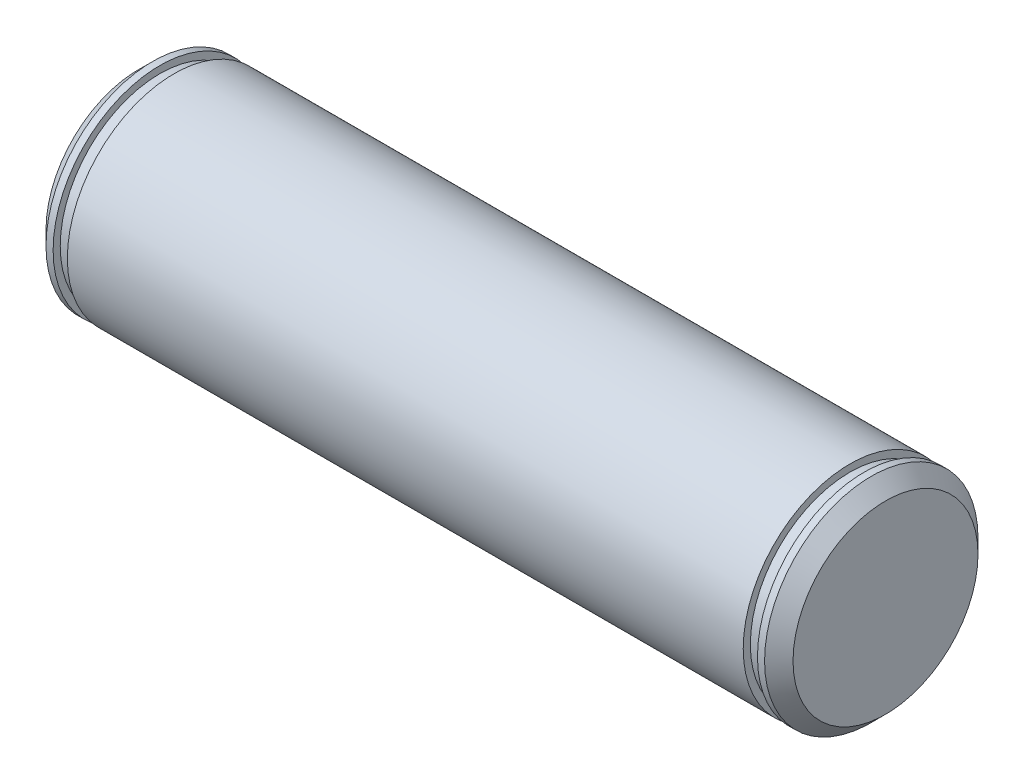
ISO-10303-21;
HEADER;
FILE_DESCRIPTION(('STEP AP214'),'2;1');
FILE_NAME('part.step','',(''),(''),'','','');
FILE_SCHEMA(('AUTOMOTIVE_DESIGN { 1 0 10303 214 1 1 1 1 }'));
ENDSEC;
DATA;
#1=APPLICATION_CONTEXT('core data for automotive mechanical design processes');
#2=APPLICATION_PROTOCOL_DEFINITION('international standard','automotive_design',2000,#1);
#3=PRODUCT_CONTEXT('',#1,'mechanical');
#4=PRODUCT('Part','Part','',(#3));
#5=PRODUCT_RELATED_PRODUCT_CATEGORY('part','',(#4));
#6=PRODUCT_DEFINITION_FORMATION('','',#4);
#7=PRODUCT_DEFINITION_CONTEXT('part definition',#1,'design');
#8=PRODUCT_DEFINITION('design','',#6,#7);
#9=PRODUCT_DEFINITION_SHAPE('','',#8);
#10=(LENGTH_UNIT() NAMED_UNIT(*) SI_UNIT(.MILLI.,.METRE.));
#11=(NAMED_UNIT(*) PLANE_ANGLE_UNIT() SI_UNIT($,.RADIAN.));
#12=(NAMED_UNIT(*) SI_UNIT($,.STERADIAN.) SOLID_ANGLE_UNIT());
#13=UNCERTAINTY_MEASURE_WITH_UNIT(LENGTH_MEASURE(1.E-05),#10,'distance_accuracy_value','');
#14=(GEOMETRIC_REPRESENTATION_CONTEXT(3) GLOBAL_UNCERTAINTY_ASSIGNED_CONTEXT((#13)) GLOBAL_UNIT_ASSIGNED_CONTEXT((#10,
#11,#12)) REPRESENTATION_CONTEXT('',''));
#15=CARTESIAN_POINT('',(0.,0.,0.));
#16=DIRECTION('',(0.,0.,1.));
#17=DIRECTION('',(1.,0.,0.));
#18=AXIS2_PLACEMENT_3D('',#15,#16,#17);
#19=CARTESIAN_POINT('',(52.5,0.,0.));
#20=DIRECTION('',(-1.,0.,0.));
#21=DIRECTION('',(0.,0.,1.));
#22=AXIS2_PLACEMENT_3D('',#19,#20,#21);
#23=PLANE('',#22);
#24=CARTESIAN_POINT('',(52.5,0.,0.));
#25=DIRECTION('',(-1.,0.,0.));
#26=DIRECTION('',(0.,0.,1.));
#27=AXIS2_PLACEMENT_3D('',#24,#25,#26);
#28=CIRCLE('',#27,13.);
#29=CARTESIAN_POINT('',(52.5,0.,13.));
#30=VERTEX_POINT('',#29);
#31=EDGE_CURVE('E10',#30,#30,#28,.T.);
#32=ORIENTED_EDGE('',*,*,#31,.F.);
#33=EDGE_LOOP('',(#32));
#34=FACE_BOUND('',#33,.T.);
#35=ADVANCED_FACE('F31',(#34),#23,.F.);
#36=CARTESIAN_POINT('',(52.5,0.,0.));
#37=DIRECTION('',(-1.,0.,0.));
#38=DIRECTION('',(0.,0.,1.));
#39=AXIS2_PLACEMENT_3D('',#36,#37,#38);
#40=CONICAL_SURFACE('',#39,13.,0.78539816339745);
#41=CARTESIAN_POINT('',(50.5,0.,0.));
#42=DIRECTION('',(-1.,0.,0.));
#43=DIRECTION('',(0.,0.,1.));
#44=AXIS2_PLACEMENT_3D('',#41,#42,#43);
#45=CIRCLE('',#44,15.);
#46=CARTESIAN_POINT('',(50.5,0.,15.));
#47=VERTEX_POINT('',#46);
#48=EDGE_CURVE('E37',#47,#47,#45,.T.);
#49=ORIENTED_EDGE('',*,*,#48,.F.);
#50=EDGE_LOOP('',(#49));
#51=FACE_BOUND('',#50,.T.);
#52=ORIENTED_EDGE('',*,*,#31,.T.);
#53=EDGE_LOOP('',(#52));
#54=FACE_BOUND('',#53,.T.);
#55=ADVANCED_FACE('F133',(#51,#54),#40,.T.);
#56=CARTESIAN_POINT('',(0.,0.,0.));
#57=DIRECTION('',(-1.,0.,0.));
#58=DIRECTION('',(0.,0.,1.));
#59=AXIS2_PLACEMENT_3D('',#56,#57,#58);
#60=CYLINDRICAL_SURFACE('',#59,15.);
#61=CARTESIAN_POINT('',(49.5,0.,0.));
#62=DIRECTION('',(-1.,0.,0.));
#63=DIRECTION('',(0.,0.,1.));
#64=AXIS2_PLACEMENT_3D('',#61,#62,#63);
#65=CIRCLE('',#64,15.);
#66=CARTESIAN_POINT('',(49.5,0.,15.));
#67=VERTEX_POINT('',#66);
#68=EDGE_CURVE('E41',#67,#67,#65,.T.);
#69=ORIENTED_EDGE('',*,*,#68,.F.);
#70=EDGE_LOOP('',(#69));
#71=FACE_BOUND('',#70,.T.);
#72=ORIENTED_EDGE('',*,*,#48,.T.);
#73=EDGE_LOOP('',(#72));
#74=FACE_BOUND('',#73,.T.);
#75=ADVANCED_FACE('F128',(#71,#74),#60,.T.);
#76=CARTESIAN_POINT('',(49.5,15.,0.));
#77=DIRECTION('',(1.,0.,0.));
#78=DIRECTION('',(0.,0.,-1.));
#79=AXIS2_PLACEMENT_3D('',#76,#77,#78);
#80=PLANE('',#79);
#81=CARTESIAN_POINT('',(49.5,0.,0.));
#82=DIRECTION('',(-1.,0.,0.));
#83=DIRECTION('',(0.,0.,1.));
#84=AXIS2_PLACEMENT_3D('',#81,#82,#83);
#85=CIRCLE('',#84,14.);
#86=CARTESIAN_POINT('',(49.5,0.,14.));
#87=VERTEX_POINT('',#86);
#88=EDGE_CURVE('E45',#87,#87,#85,.T.);
#89=ORIENTED_EDGE('',*,*,#88,.F.);
#90=EDGE_LOOP('',(#89));
#91=FACE_BOUND('',#90,.T.);
#92=ORIENTED_EDGE('',*,*,#68,.T.);
#93=EDGE_LOOP('',(#92));
#94=FACE_BOUND('',#93,.T.);
#95=ADVANCED_FACE('F122',(#91,#94),#80,.F.);
#96=CARTESIAN_POINT('',(0.,0.,0.));
#97=DIRECTION('',(-1.,0.,0.));
#98=DIRECTION('',(0.,0.,1.));
#99=AXIS2_PLACEMENT_3D('',#96,#97,#98);
#100=CYLINDRICAL_SURFACE('',#99,14.);
#101=CARTESIAN_POINT('',(47.5,0.,0.));
#102=DIRECTION('',(-1.,0.,0.));
#103=DIRECTION('',(0.,0.,1.));
#104=AXIS2_PLACEMENT_3D('',#101,#102,#103);
#105=CIRCLE('',#104,14.);
#106=CARTESIAN_POINT('',(47.5,0.,14.));
#107=VERTEX_POINT('',#106);
#108=EDGE_CURVE('E50',#107,#107,#105,.T.);
#109=ORIENTED_EDGE('',*,*,#108,.F.);
#110=EDGE_LOOP('',(#109));
#111=FACE_BOUND('',#110,.T.);
#112=ORIENTED_EDGE('',*,*,#88,.T.);
#113=EDGE_LOOP('',(#112));
#114=FACE_BOUND('',#113,.T.);
#115=ADVANCED_FACE('F116',(#111,#114),#100,.T.);
#116=CARTESIAN_POINT('',(47.5,14.,0.));
#117=DIRECTION('',(-1.,0.,0.));
#118=DIRECTION('',(0.,0.,1.));
#119=AXIS2_PLACEMENT_3D('',#116,#117,#118);
#120=PLANE('',#119);
#121=CARTESIAN_POINT('',(47.5,0.,0.));
#122=DIRECTION('',(-1.,0.,0.));
#123=DIRECTION('',(0.,0.,1.));
#124=AXIS2_PLACEMENT_3D('',#121,#122,#123);
#125=CIRCLE('',#124,15.);
#126=CARTESIAN_POINT('',(47.5,0.,15.));
#127=VERTEX_POINT('',#126);
#128=EDGE_CURVE('E53',#127,#127,#125,.T.);
#129=ORIENTED_EDGE('',*,*,#128,.F.);
#130=EDGE_LOOP('',(#129));
#131=FACE_BOUND('',#130,.T.);
#132=ORIENTED_EDGE('',*,*,#108,.T.);
#133=EDGE_LOOP('',(#132));
#134=FACE_BOUND('',#133,.T.);
#135=ADVANCED_FACE('F110',(#131,#134),#120,.F.);
#136=CARTESIAN_POINT('',(0.,0.,0.));
#137=DIRECTION('',(-1.,0.,0.));
#138=DIRECTION('',(0.,0.,1.));
#139=AXIS2_PLACEMENT_3D('',#136,#137,#138);
#140=CYLINDRICAL_SURFACE('',#139,15.);
#141=CARTESIAN_POINT('',(-47.5,0.,0.));
#142=DIRECTION('',(-1.,0.,0.));
#143=DIRECTION('',(0.,0.,1.));
#144=AXIS2_PLACEMENT_3D('',#141,#142,#143);
#145=CIRCLE('',#144,15.);
#146=CARTESIAN_POINT('',(-47.5,0.,15.));
#147=VERTEX_POINT('',#146);
#148=EDGE_CURVE('E56',#147,#147,#145,.T.);
#149=ORIENTED_EDGE('',*,*,#148,.F.);
#150=EDGE_LOOP('',(#149));
#151=FACE_BOUND('',#150,.T.);
#152=ORIENTED_EDGE('',*,*,#128,.T.);
#153=EDGE_LOOP('',(#152));
#154=FACE_BOUND('',#153,.T.);
#155=ADVANCED_FACE('F104',(#151,#154),#140,.T.);
#156=CARTESIAN_POINT('',(-47.5,14.,0.));
#157=DIRECTION('',(1.,0.,0.));
#158=DIRECTION('',(0.,0.,-1.));
#159=AXIS2_PLACEMENT_3D('',#156,#157,#158);
#160=PLANE('',#159);
#161=CARTESIAN_POINT('',(-47.5,0.,0.));
#162=DIRECTION('',(-1.,0.,0.));
#163=DIRECTION('',(0.,0.,1.));
#164=AXIS2_PLACEMENT_3D('',#161,#162,#163);
#165=CIRCLE('',#164,14.);
#166=CARTESIAN_POINT('',(-47.5,0.,14.));
#167=VERTEX_POINT('',#166);
#168=EDGE_CURVE('E59',#167,#167,#165,.T.);
#169=ORIENTED_EDGE('',*,*,#168,.F.);
#170=EDGE_LOOP('',(#169));
#171=FACE_BOUND('',#170,.T.);
#172=ORIENTED_EDGE('',*,*,#148,.T.);
#173=EDGE_LOOP('',(#172));
#174=FACE_BOUND('',#173,.T.);
#175=ADVANCED_FACE('F98',(#171,#174),#160,.F.);
#176=CARTESIAN_POINT('',(0.,0.,0.));
#177=DIRECTION('',(-1.,0.,0.));
#178=DIRECTION('',(0.,0.,1.));
#179=AXIS2_PLACEMENT_3D('',#176,#177,#178);
#180=CYLINDRICAL_SURFACE('',#179,14.);
#181=CARTESIAN_POINT('',(-49.5,0.,0.));
#182=DIRECTION('',(-1.,0.,0.));
#183=DIRECTION('',(0.,0.,1.));
#184=AXIS2_PLACEMENT_3D('',#181,#182,#183);
#185=CIRCLE('',#184,14.);
#186=CARTESIAN_POINT('',(-49.5,0.,14.));
#187=VERTEX_POINT('',#186);
#188=EDGE_CURVE('E62',#187,#187,#185,.T.);
#189=ORIENTED_EDGE('',*,*,#188,.F.);
#190=EDGE_LOOP('',(#189));
#191=FACE_BOUND('',#190,.T.);
#192=ORIENTED_EDGE('',*,*,#168,.T.);
#193=EDGE_LOOP('',(#192));
#194=FACE_BOUND('',#193,.T.);
#195=ADVANCED_FACE('F92',(#191,#194),#180,.T.);
#196=CARTESIAN_POINT('',(-49.5,15.,0.));
#197=DIRECTION('',(-1.,0.,0.));
#198=DIRECTION('',(0.,0.,1.));
#199=AXIS2_PLACEMENT_3D('',#196,#197,#198);
#200=PLANE('',#199);
#201=CARTESIAN_POINT('',(-49.5,0.,0.));
#202=DIRECTION('',(-1.,0.,0.));
#203=DIRECTION('',(0.,0.,1.));
#204=AXIS2_PLACEMENT_3D('',#201,#202,#203);
#205=CIRCLE('',#204,15.);
#206=CARTESIAN_POINT('',(-49.5,0.,15.));
#207=VERTEX_POINT('',#206);
#208=EDGE_CURVE('E65',#207,#207,#205,.T.);
#209=ORIENTED_EDGE('',*,*,#208,.F.);
#210=EDGE_LOOP('',(#209));
#211=FACE_BOUND('',#210,.T.);
#212=ORIENTED_EDGE('',*,*,#188,.T.);
#213=EDGE_LOOP('',(#212));
#214=FACE_BOUND('',#213,.T.);
#215=ADVANCED_FACE('F86',(#211,#214),#200,.F.);
#216=CARTESIAN_POINT('',(0.,0.,0.));
#217=DIRECTION('',(-1.,0.,0.));
#218=DIRECTION('',(0.,0.,1.));
#219=AXIS2_PLACEMENT_3D('',#216,#217,#218);
#220=CYLINDRICAL_SURFACE('',#219,15.);
#221=CARTESIAN_POINT('',(-50.5,0.,0.));
#222=DIRECTION('',(-1.,0.,0.));
#223=DIRECTION('',(0.,0.,1.));
#224=AXIS2_PLACEMENT_3D('',#221,#222,#223);
#225=CIRCLE('',#224,15.);
#226=CARTESIAN_POINT('',(-50.5,0.,15.));
#227=VERTEX_POINT('',#226);
#228=EDGE_CURVE('E68',#227,#227,#225,.T.);
#229=ORIENTED_EDGE('',*,*,#228,.F.);
#230=EDGE_LOOP('',(#229));
#231=FACE_BOUND('',#230,.T.);
#232=ORIENTED_EDGE('',*,*,#208,.T.);
#233=EDGE_LOOP('',(#232));
#234=FACE_BOUND('',#233,.T.);
#235=ADVANCED_FACE('F80',(#231,#234),#220,.T.);
#236=CARTESIAN_POINT('',(-50.5,0.,0.));
#237=DIRECTION('',(1.,0.,0.));
#238=DIRECTION('',(0.,0.,-1.));
#239=AXIS2_PLACEMENT_3D('',#236,#237,#238);
#240=CONICAL_SURFACE('',#239,15.,0.785398163397453);
#241=CARTESIAN_POINT('',(-52.5,0.,0.));
#242=DIRECTION('',(-1.,0.,0.));
#243=DIRECTION('',(0.,0.,1.));
#244=AXIS2_PLACEMENT_3D('',#241,#242,#243);
#245=CIRCLE('',#244,13.);
#246=CARTESIAN_POINT('',(-52.5,0.,13.));
#247=VERTEX_POINT('',#246);
#248=EDGE_CURVE('E71',#247,#247,#245,.T.);
#249=ORIENTED_EDGE('',*,*,#248,.F.);
#250=EDGE_LOOP('',(#249));
#251=FACE_BOUND('',#250,.T.);
#252=ORIENTED_EDGE('',*,*,#228,.T.);
#253=EDGE_LOOP('',(#252));
#254=FACE_BOUND('',#253,.T.);
#255=ADVANCED_FACE('F77',(#251,#254),#240,.T.);
#256=CARTESIAN_POINT('',(-52.5,0.,0.));
#257=DIRECTION('',(1.,0.,0.));
#258=DIRECTION('',(0.,0.,-1.));
#259=AXIS2_PLACEMENT_3D('',#256,#257,#258);
#260=PLANE('',#259);
#261=ORIENTED_EDGE('',*,*,#248,.T.);
#262=EDGE_LOOP('',(#261));
#263=FACE_BOUND('',#262,.T.);
#264=ADVANCED_FACE('F75',(#263),#260,.F.);
#265=CLOSED_SHELL('',(#35,#55,#75,#95,#115,#135,#155,#175,#195,#215,#235,#255,#264));
#266=MANIFOLD_SOLID_BREP('B2',#265);
#267=ADVANCED_BREP_SHAPE_REPRESENTATION('',(#18,#266),#14);
#268=SHAPE_DEFINITION_REPRESENTATION(#9,#267);
ENDSEC;
END-ISO-10303-21;
